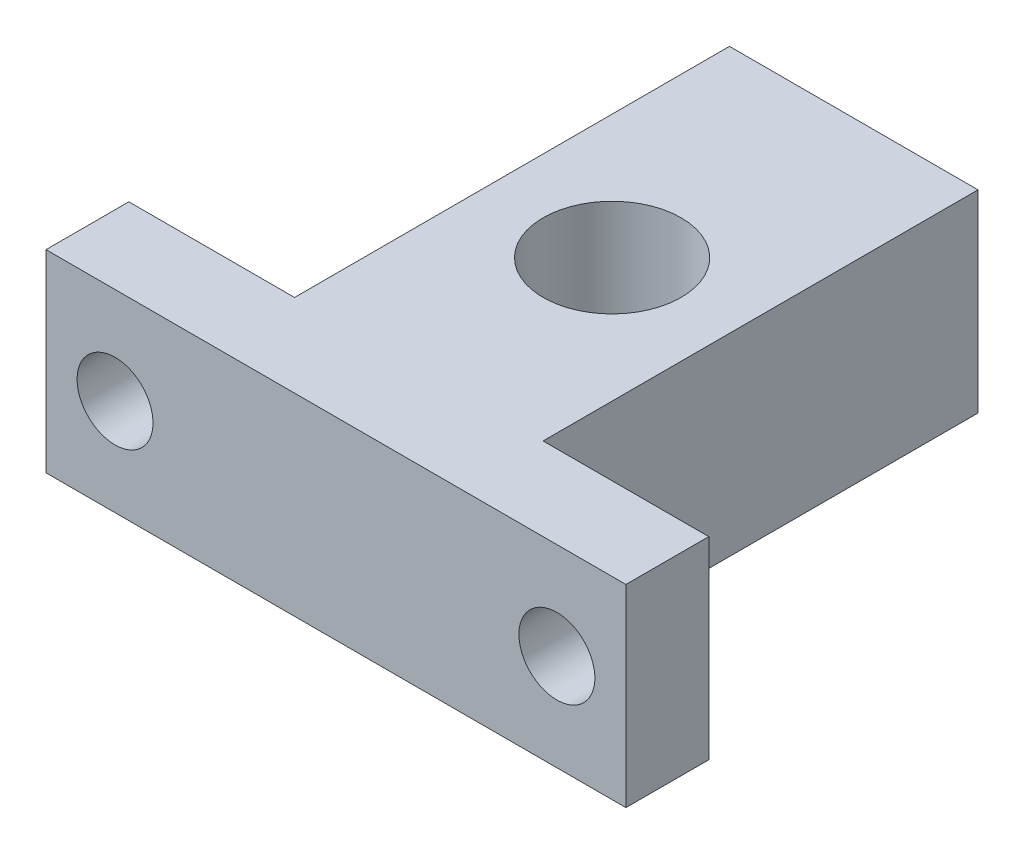
ISO-10303-21;
HEADER;
FILE_DESCRIPTION(('STEP AP214'),'2;1');
FILE_NAME('part.step','',(''),(''),'','','');
FILE_SCHEMA(('AUTOMOTIVE_DESIGN { 1 0 10303 214 1 1 1 1 }'));
ENDSEC;
DATA;
#1=APPLICATION_CONTEXT('core data for automotive mechanical design processes');
#2=APPLICATION_PROTOCOL_DEFINITION('international standard','automotive_design',2000,#1);
#3=PRODUCT_CONTEXT('',#1,'mechanical');
#4=PRODUCT('Part','Part','',(#3));
#5=PRODUCT_RELATED_PRODUCT_CATEGORY('part','',(#4));
#6=PRODUCT_DEFINITION_FORMATION('','',#4);
#7=PRODUCT_DEFINITION_CONTEXT('part definition',#1,'design');
#8=PRODUCT_DEFINITION('design','',#6,#7);
#9=PRODUCT_DEFINITION_SHAPE('','',#8);
#10=(LENGTH_UNIT() NAMED_UNIT(*) SI_UNIT(.MILLI.,.METRE.));
#11=(NAMED_UNIT(*) PLANE_ANGLE_UNIT() SI_UNIT($,.RADIAN.));
#12=(NAMED_UNIT(*) SI_UNIT($,.STERADIAN.) SOLID_ANGLE_UNIT());
#13=UNCERTAINTY_MEASURE_WITH_UNIT(LENGTH_MEASURE(1.E-05),#10,'distance_accuracy_value','');
#14=(GEOMETRIC_REPRESENTATION_CONTEXT(3) GLOBAL_UNCERTAINTY_ASSIGNED_CONTEXT((#13)) GLOBAL_UNIT_ASSIGNED_CONTEXT((#10,
#11,#12)) REPRESENTATION_CONTEXT('',''));
#15=CARTESIAN_POINT('',(0.,0.,0.));
#16=DIRECTION('',(0.,0.,1.));
#17=DIRECTION('',(1.,0.,0.));
#18=AXIS2_PLACEMENT_3D('',#15,#16,#17);
#19=CARTESIAN_POINT('',(-16.,7.,12.75));
#20=DIRECTION('',(0.,0.,-1.));
#21=DIRECTION('',(-1.,0.,0.));
#22=AXIS2_PLACEMENT_3D('',#19,#20,#21);
#23=CYLINDRICAL_SURFACE('',#22,2.74999999999999);
#24=CARTESIAN_POINT('',(-16.,7.,18.75));
#25=DIRECTION('',(0.,0.,-1.));
#26=DIRECTION('',(-1.,0.,0.));
#27=AXIS2_PLACEMENT_3D('',#24,#25,#26);
#28=CIRCLE('',#27,2.74999999999999);
#29=CARTESIAN_POINT('',(-18.75,7.,18.75));
#30=VERTEX_POINT('',#29);
#31=EDGE_CURVE('E91',#30,#30,#28,.F.);
#32=ORIENTED_EDGE('',*,*,#31,.T.);
#33=EDGE_LOOP('',(#32));
#34=FACE_BOUND('',#33,.T.);
#35=CARTESIAN_POINT('',(-16.,7.,12.75));
#36=DIRECTION('',(0.,0.,-1.));
#37=DIRECTION('',(-1.,0.,0.));
#38=AXIS2_PLACEMENT_3D('',#35,#36,#37);
#39=CIRCLE('',#38,2.74999999999999);
#40=CARTESIAN_POINT('',(-18.75,7.,12.75));
#41=VERTEX_POINT('',#40);
#42=EDGE_CURVE('E99',#41,#41,#39,.T.);
#43=ORIENTED_EDGE('',*,*,#42,.T.);
#44=EDGE_LOOP('',(#43));
#45=FACE_BOUND('',#44,.T.);
#46=ADVANCED_FACE('F17',(#34,#45),#23,.F.);
#47=CARTESIAN_POINT('',(16.,7.,12.75));
#48=DIRECTION('',(0.,0.,-1.));
#49=DIRECTION('',(-1.,0.,0.));
#50=AXIS2_PLACEMENT_3D('',#47,#48,#49);
#51=CYLINDRICAL_SURFACE('',#50,2.74999999999999);
#52=CARTESIAN_POINT('',(16.,7.,18.75));
#53=DIRECTION('',(0.,0.,-1.));
#54=DIRECTION('',(-1.,0.,0.));
#55=AXIS2_PLACEMENT_3D('',#52,#53,#54);
#56=CIRCLE('',#55,2.74999999999999);
#57=CARTESIAN_POINT('',(13.25,7.,18.75));
#58=VERTEX_POINT('',#57);
#59=EDGE_CURVE('E20',#58,#58,#56,.F.);
#60=ORIENTED_EDGE('',*,*,#59,.T.);
#61=EDGE_LOOP('',(#60));
#62=FACE_BOUND('',#61,.T.);
#63=CARTESIAN_POINT('',(16.,7.,12.75));
#64=DIRECTION('',(0.,0.,-1.));
#65=DIRECTION('',(-1.,0.,0.));
#66=AXIS2_PLACEMENT_3D('',#63,#64,#65);
#67=CIRCLE('',#66,2.74999999999999);
#68=CARTESIAN_POINT('',(13.25,7.,12.75));
#69=VERTEX_POINT('',#68);
#70=EDGE_CURVE('E111',#69,#69,#67,.T.);
#71=ORIENTED_EDGE('',*,*,#70,.T.);
#72=EDGE_LOOP('',(#71));
#73=FACE_BOUND('',#72,.T.);
#74=ADVANCED_FACE('F123',(#62,#73),#51,.F.);
#75=CARTESIAN_POINT('',(0.,0.,0.));
#76=DIRECTION('',(0.,-1.,0.));
#77=DIRECTION('',(0.,0.,-1.));
#78=AXIS2_PLACEMENT_3D('',#75,#76,#77);
#79=PLANE('',#78);
#80=CARTESIAN_POINT('',(0.,0.,-1.25));
#81=DIRECTION('',(0.,-1.,0.));
#82=DIRECTION('',(0.,0.,-1.));
#83=AXIS2_PLACEMENT_3D('',#80,#81,#82);
#84=CIRCLE('',#83,5.);
#85=CARTESIAN_POINT('',(0.,0.,-6.25));
#86=VERTEX_POINT('',#85);
#87=EDGE_CURVE('E108',#86,#86,#84,.F.);
#88=ORIENTED_EDGE('',*,*,#87,.T.);
#89=EDGE_LOOP('',(#88));
#90=FACE_BOUND('',#89,.T.);
#91=DIRECTION('',(0.,0.,1.));
#92=VECTOR('',#91,1.);
#93=CARTESIAN_POINT('',(9.,0.,12.75));
#94=LINE('',#93,#92);
#95=CARTESIAN_POINT('',(9.,0.,-18.75));
#96=VERTEX_POINT('',#95);
#97=CARTESIAN_POINT('',(9.,0.,12.75));
#98=VERTEX_POINT('',#97);
#99=EDGE_CURVE('E115',#96,#98,#94,.T.);
#100=ORIENTED_EDGE('',*,*,#99,.T.);
#101=DIRECTION('',(1.,0.,0.));
#102=VECTOR('',#101,1.);
#103=CARTESIAN_POINT('',(9.,0.,12.75));
#104=LINE('',#103,#102);
#105=CARTESIAN_POINT('',(21.,0.,12.75));
#106=VERTEX_POINT('',#105);
#107=EDGE_CURVE('E282',#98,#106,#104,.T.);
#108=ORIENTED_EDGE('',*,*,#107,.T.);
#109=DIRECTION('',(0.,0.,1.));
#110=VECTOR('',#109,1.);
#111=CARTESIAN_POINT('',(21.,0.,18.75));
#112=LINE('',#111,#110);
#113=CARTESIAN_POINT('',(21.,0.,18.75));
#114=VERTEX_POINT('',#113);
#115=EDGE_CURVE('E85',#106,#114,#112,.T.);
#116=ORIENTED_EDGE('',*,*,#115,.T.);
#117=DIRECTION('',(-1.,0.,0.));
#118=VECTOR('',#117,1.);
#119=CARTESIAN_POINT('',(21.,0.,18.75));
#120=LINE('',#119,#118);
#121=CARTESIAN_POINT('',(-21.,0.,18.75));
#122=VERTEX_POINT('',#121);
#123=EDGE_CURVE('E83',#114,#122,#120,.T.);
#124=ORIENTED_EDGE('',*,*,#123,.T.);
#125=DIRECTION('',(0.,0.,-1.));
#126=VECTOR('',#125,1.);
#127=CARTESIAN_POINT('',(-21.,0.,12.75));
#128=LINE('',#127,#126);
#129=CARTESIAN_POINT('',(-21.,0.,12.75));
#130=VERTEX_POINT('',#129);
#131=EDGE_CURVE('E80',#122,#130,#128,.T.);
#132=ORIENTED_EDGE('',*,*,#131,.T.);
#133=DIRECTION('',(1.,0.,0.));
#134=VECTOR('',#133,1.);
#135=CARTESIAN_POINT('',(-9.,0.,12.75));
#136=LINE('',#135,#134);
#137=CARTESIAN_POINT('',(-9.,0.,12.75));
#138=VERTEX_POINT('',#137);
#139=EDGE_CURVE('E266',#130,#138,#136,.T.);
#140=ORIENTED_EDGE('',*,*,#139,.T.);
#141=DIRECTION('',(0.,0.,-1.));
#142=VECTOR('',#141,1.);
#143=CARTESIAN_POINT('',(-9.,0.,12.75));
#144=LINE('',#143,#142);
#145=CARTESIAN_POINT('',(-9.,0.,-18.75));
#146=VERTEX_POINT('',#145);
#147=EDGE_CURVE('E295',#138,#146,#144,.T.);
#148=ORIENTED_EDGE('',*,*,#147,.T.);
#149=DIRECTION('',(1.,0.,0.));
#150=VECTOR('',#149,1.);
#151=CARTESIAN_POINT('',(9.,0.,-18.75));
#152=LINE('',#151,#150);
#153=EDGE_CURVE('E290',#146,#96,#152,.T.);
#154=ORIENTED_EDGE('',*,*,#153,.T.);
#155=EDGE_LOOP('',(#100,#108,#116,#124,#132,#140,#148,#154));
#156=FACE_BOUND('',#155,.T.);
#157=ADVANCED_FACE('F84',(#90,#156),#79,.T.);
#158=CARTESIAN_POINT('',(21.,14.,18.75));
#159=DIRECTION('',(0.,0.,-1.));
#160=DIRECTION('',(-1.,0.,0.));
#161=AXIS2_PLACEMENT_3D('',#158,#159,#160);
#162=PLANE('',#161);
#163=DIRECTION('',(0.,1.,0.));
#164=VECTOR('',#163,1.);
#165=CARTESIAN_POINT('',(21.,14.,18.75));
#166=LINE('',#165,#164);
#167=CARTESIAN_POINT('',(21.,14.,18.75));
#168=VERTEX_POINT('',#167);
#169=EDGE_CURVE('E280',#114,#168,#166,.T.);
#170=ORIENTED_EDGE('',*,*,#169,.T.);
#171=DIRECTION('',(1.,0.,0.));
#172=VECTOR('',#171,1.);
#173=CARTESIAN_POINT('',(0.,14.,18.75));
#174=LINE('',#173,#172);
#175=CARTESIAN_POINT('',(-21.,14.,18.75));
#176=VERTEX_POINT('',#175);
#177=EDGE_CURVE('E104',#168,#176,#174,.F.);
#178=ORIENTED_EDGE('',*,*,#177,.T.);
#179=DIRECTION('',(0.,1.,0.));
#180=VECTOR('',#179,1.);
#181=CARTESIAN_POINT('',(-21.,14.,18.75));
#182=LINE('',#181,#180);
#183=EDGE_CURVE('E90',#176,#122,#182,.F.);
#184=ORIENTED_EDGE('',*,*,#183,.T.);
#185=ORIENTED_EDGE('',*,*,#123,.F.);
#186=EDGE_LOOP('',(#170,#178,#184,#185));
#187=FACE_BOUND('',#186,.T.);
#188=ORIENTED_EDGE('',*,*,#31,.F.);
#189=EDGE_LOOP('',(#188));
#190=FACE_BOUND('',#189,.T.);
#191=ORIENTED_EDGE('',*,*,#59,.F.);
#192=EDGE_LOOP('',(#191));
#193=FACE_BOUND('',#192,.T.);
#194=ADVANCED_FACE('F102',(#187,#190,#193),#162,.F.);
#195=CARTESIAN_POINT('',(-21.,14.,12.75));
#196=DIRECTION('',(1.,0.,0.));
#197=DIRECTION('',(0.,0.,-1.));
#198=AXIS2_PLACEMENT_3D('',#195,#196,#197);
#199=PLANE('',#198);
#200=ORIENTED_EDGE('',*,*,#183,.F.);
#201=DIRECTION('',(0.,0.,-1.));
#202=VECTOR('',#201,1.);
#203=CARTESIAN_POINT('',(-21.,14.,0.));
#204=LINE('',#203,#202);
#205=CARTESIAN_POINT('',(-21.,14.,12.75));
#206=VERTEX_POINT('',#205);
#207=EDGE_CURVE('E269',#176,#206,#204,.T.);
#208=ORIENTED_EDGE('',*,*,#207,.T.);
#209=DIRECTION('',(0.,1.,0.));
#210=VECTOR('',#209,1.);
#211=CARTESIAN_POINT('',(-21.,14.,12.75));
#212=LINE('',#211,#210);
#213=EDGE_CURVE('E98',#206,#130,#212,.F.);
#214=ORIENTED_EDGE('',*,*,#213,.T.);
#215=ORIENTED_EDGE('',*,*,#131,.F.);
#216=EDGE_LOOP('',(#200,#208,#214,#215));
#217=FACE_BOUND('',#216,.T.);
#218=ADVANCED_FACE('F95',(#217),#199,.F.);
#219=CARTESIAN_POINT('',(-9.,14.,12.75));
#220=DIRECTION('',(0.,0.,1.));
#221=DIRECTION('',(1.,0.,0.));
#222=AXIS2_PLACEMENT_3D('',#219,#220,#221);
#223=PLANE('',#222);
#224=ORIENTED_EDGE('',*,*,#213,.F.);
#225=DIRECTION('',(1.,0.,0.));
#226=VECTOR('',#225,1.);
#227=CARTESIAN_POINT('',(0.,14.,12.75));
#228=LINE('',#227,#226);
#229=CARTESIAN_POINT('',(-9.,14.,12.75));
#230=VERTEX_POINT('',#229);
#231=EDGE_CURVE('E265',#206,#230,#228,.T.);
#232=ORIENTED_EDGE('',*,*,#231,.T.);
#233=DIRECTION('',(0.,1.,0.));
#234=VECTOR('',#233,1.);
#235=CARTESIAN_POINT('',(-9.,14.,12.75));
#236=LINE('',#235,#234);
#237=EDGE_CURVE('E297',#230,#138,#236,.F.);
#238=ORIENTED_EDGE('',*,*,#237,.T.);
#239=ORIENTED_EDGE('',*,*,#139,.F.);
#240=EDGE_LOOP('',(#224,#232,#238,#239));
#241=FACE_BOUND('',#240,.T.);
#242=ORIENTED_EDGE('',*,*,#42,.F.);
#243=EDGE_LOOP('',(#242));
#244=FACE_BOUND('',#243,.T.);
#245=ADVANCED_FACE('F133',(#241,#244),#223,.F.);
#246=CARTESIAN_POINT('',(-9.,14.,12.75));
#247=DIRECTION('',(1.,0.,0.));
#248=DIRECTION('',(0.,0.,-1.));
#249=AXIS2_PLACEMENT_3D('',#246,#247,#248);
#250=PLANE('',#249);
#251=ORIENTED_EDGE('',*,*,#237,.F.);
#252=DIRECTION('',(0.,0.,-1.));
#253=VECTOR('',#252,1.);
#254=CARTESIAN_POINT('',(-9.,14.,0.));
#255=LINE('',#254,#253);
#256=CARTESIAN_POINT('',(-9.,14.,-18.75));
#257=VERTEX_POINT('',#256);
#258=EDGE_CURVE('E272',#230,#257,#255,.T.);
#259=ORIENTED_EDGE('',*,*,#258,.T.);
#260=DIRECTION('',(0.,1.,0.));
#261=VECTOR('',#260,1.);
#262=CARTESIAN_POINT('',(-9.,14.,-18.75));
#263=LINE('',#262,#261);
#264=EDGE_CURVE('E292',#257,#146,#263,.F.);
#265=ORIENTED_EDGE('',*,*,#264,.T.);
#266=ORIENTED_EDGE('',*,*,#147,.F.);
#267=EDGE_LOOP('',(#251,#259,#265,#266));
#268=FACE_BOUND('',#267,.T.);
#269=ADVANCED_FACE('F164',(#268),#250,.F.);
#270=CARTESIAN_POINT('',(9.,14.,-18.75));
#271=DIRECTION('',(0.,0.,1.));
#272=DIRECTION('',(1.,0.,0.));
#273=AXIS2_PLACEMENT_3D('',#270,#271,#272);
#274=PLANE('',#273);
#275=ORIENTED_EDGE('',*,*,#264,.F.);
#276=DIRECTION('',(1.,0.,0.));
#277=VECTOR('',#276,1.);
#278=CARTESIAN_POINT('',(0.,14.,-18.75));
#279=LINE('',#278,#277);
#280=CARTESIAN_POINT('',(9.,14.,-18.75));
#281=VERTEX_POINT('',#280);
#282=EDGE_CURVE('E302',#257,#281,#279,.T.);
#283=ORIENTED_EDGE('',*,*,#282,.T.);
#284=DIRECTION('',(0.,1.,0.));
#285=VECTOR('',#284,1.);
#286=CARTESIAN_POINT('',(9.,14.,-18.75));
#287=LINE('',#286,#285);
#288=EDGE_CURVE('E287',#281,#96,#287,.F.);
#289=ORIENTED_EDGE('',*,*,#288,.T.);
#290=ORIENTED_EDGE('',*,*,#153,.F.);
#291=EDGE_LOOP('',(#275,#283,#289,#290));
#292=FACE_BOUND('',#291,.T.);
#293=ADVANCED_FACE('F160',(#292),#274,.F.);
#294=CARTESIAN_POINT('',(9.,14.,12.75));
#295=DIRECTION('',(-1.,0.,0.));
#296=DIRECTION('',(0.,0.,1.));
#297=AXIS2_PLACEMENT_3D('',#294,#295,#296);
#298=PLANE('',#297);
#299=ORIENTED_EDGE('',*,*,#288,.F.);
#300=DIRECTION('',(0.,0.,-1.));
#301=VECTOR('',#300,1.);
#302=CARTESIAN_POINT('',(9.,14.,0.));
#303=LINE('',#302,#301);
#304=CARTESIAN_POINT('',(9.,14.,12.75));
#305=VERTEX_POINT('',#304);
#306=EDGE_CURVE('E305',#281,#305,#303,.F.);
#307=ORIENTED_EDGE('',*,*,#306,.T.);
#308=DIRECTION('',(0.,1.,0.));
#309=VECTOR('',#308,1.);
#310=CARTESIAN_POINT('',(9.,14.,12.75));
#311=LINE('',#310,#309);
#312=EDGE_CURVE('E114',#305,#98,#311,.F.);
#313=ORIENTED_EDGE('',*,*,#312,.T.);
#314=ORIENTED_EDGE('',*,*,#99,.F.);
#315=EDGE_LOOP('',(#299,#307,#313,#314));
#316=FACE_BOUND('',#315,.T.);
#317=ADVANCED_FACE('F156',(#316),#298,.F.);
#318=CARTESIAN_POINT('',(9.,14.,12.75));
#319=DIRECTION('',(0.,0.,1.));
#320=DIRECTION('',(1.,0.,0.));
#321=AXIS2_PLACEMENT_3D('',#318,#319,#320);
#322=PLANE('',#321);
#323=ORIENTED_EDGE('',*,*,#312,.F.);
#324=DIRECTION('',(1.,0.,0.));
#325=VECTOR('',#324,1.);
#326=CARTESIAN_POINT('',(0.,14.,12.75));
#327=LINE('',#326,#325);
#328=CARTESIAN_POINT('',(21.,14.,12.75));
#329=VERTEX_POINT('',#328);
#330=EDGE_CURVE('E307',#305,#329,#327,.T.);
#331=ORIENTED_EDGE('',*,*,#330,.T.);
#332=DIRECTION('',(0.,1.,0.));
#333=VECTOR('',#332,1.);
#334=CARTESIAN_POINT('',(21.,14.,12.75));
#335=LINE('',#334,#333);
#336=EDGE_CURVE('E35',#329,#106,#335,.F.);
#337=ORIENTED_EDGE('',*,*,#336,.T.);
#338=ORIENTED_EDGE('',*,*,#107,.F.);
#339=EDGE_LOOP('',(#323,#331,#337,#338));
#340=FACE_BOUND('',#339,.T.);
#341=ORIENTED_EDGE('',*,*,#70,.F.);
#342=EDGE_LOOP('',(#341));
#343=FACE_BOUND('',#342,.T.);
#344=ADVANCED_FACE('F153',(#340,#343),#322,.F.);
#345=CARTESIAN_POINT('',(21.,14.,18.75));
#346=DIRECTION('',(-1.,0.,0.));
#347=DIRECTION('',(0.,0.,1.));
#348=AXIS2_PLACEMENT_3D('',#345,#346,#347);
#349=PLANE('',#348);
#350=ORIENTED_EDGE('',*,*,#336,.F.);
#351=DIRECTION('',(0.,0.,-1.));
#352=VECTOR('',#351,1.);
#353=CARTESIAN_POINT('',(21.,14.,0.));
#354=LINE('',#353,#352);
#355=EDGE_CURVE('E26',#329,#168,#354,.F.);
#356=ORIENTED_EDGE('',*,*,#355,.T.);
#357=ORIENTED_EDGE('',*,*,#169,.F.);
#358=ORIENTED_EDGE('',*,*,#115,.F.);
#359=EDGE_LOOP('',(#350,#356,#357,#358));
#360=FACE_BOUND('',#359,.T.);
#361=ADVANCED_FACE('F145',(#360),#349,.F.);
#362=CARTESIAN_POINT('',(0.,14.,-1.25));
#363=DIRECTION('',(0.,-1.,0.));
#364=DIRECTION('',(0.,0.,-1.));
#365=AXIS2_PLACEMENT_3D('',#362,#363,#364);
#366=CYLINDRICAL_SURFACE('',#365,5.);
#367=ORIENTED_EDGE('',*,*,#87,.F.);
#368=EDGE_LOOP('',(#367));
#369=FACE_BOUND('',#368,.T.);
#370=CARTESIAN_POINT('',(0.,14.,-1.25));
#371=DIRECTION('',(0.,-1.,0.));
#372=DIRECTION('',(0.,0.,-1.));
#373=AXIS2_PLACEMENT_3D('',#370,#371,#372);
#374=CIRCLE('',#373,5.);
#375=CARTESIAN_POINT('',(0.,14.,-6.25));
#376=VERTEX_POINT('',#375);
#377=EDGE_CURVE('E11',#376,#376,#374,.F.);
#378=ORIENTED_EDGE('',*,*,#377,.T.);
#379=EDGE_LOOP('',(#378));
#380=FACE_BOUND('',#379,.T.);
#381=ADVANCED_FACE('F139',(#369,#380),#366,.F.);
#382=CARTESIAN_POINT('',(0.,14.,0.));
#383=DIRECTION('',(0.,-1.,0.));
#384=DIRECTION('',(0.,0.,-1.));
#385=AXIS2_PLACEMENT_3D('',#382,#383,#384);
#386=PLANE('',#385);
#387=ORIENTED_EDGE('',*,*,#377,.F.);
#388=EDGE_LOOP('',(#387));
#389=FACE_BOUND('',#388,.T.);
#390=ORIENTED_EDGE('',*,*,#330,.F.);
#391=ORIENTED_EDGE('',*,*,#306,.F.);
#392=ORIENTED_EDGE('',*,*,#282,.F.);
#393=ORIENTED_EDGE('',*,*,#258,.F.);
#394=ORIENTED_EDGE('',*,*,#231,.F.);
#395=ORIENTED_EDGE('',*,*,#207,.F.);
#396=ORIENTED_EDGE('',*,*,#177,.F.);
#397=ORIENTED_EDGE('',*,*,#355,.F.);
#398=EDGE_LOOP('',(#390,#391,#392,#393,#394,#395,#396,#397));
#399=FACE_BOUND('',#398,.T.);
#400=ADVANCED_FACE('F137',(#389,#399),#386,.F.);
#401=CLOSED_SHELL('',(#46,#74,#157,#194,#218,#245,#269,#293,#317,#344,#361,#381,#400));
#402=MANIFOLD_SOLID_BREP('B1',#401);
#403=ADVANCED_BREP_SHAPE_REPRESENTATION('',(#18,#402),#14);
#404=SHAPE_DEFINITION_REPRESENTATION(#9,#403);
ENDSEC;
END-ISO-10303-21;
